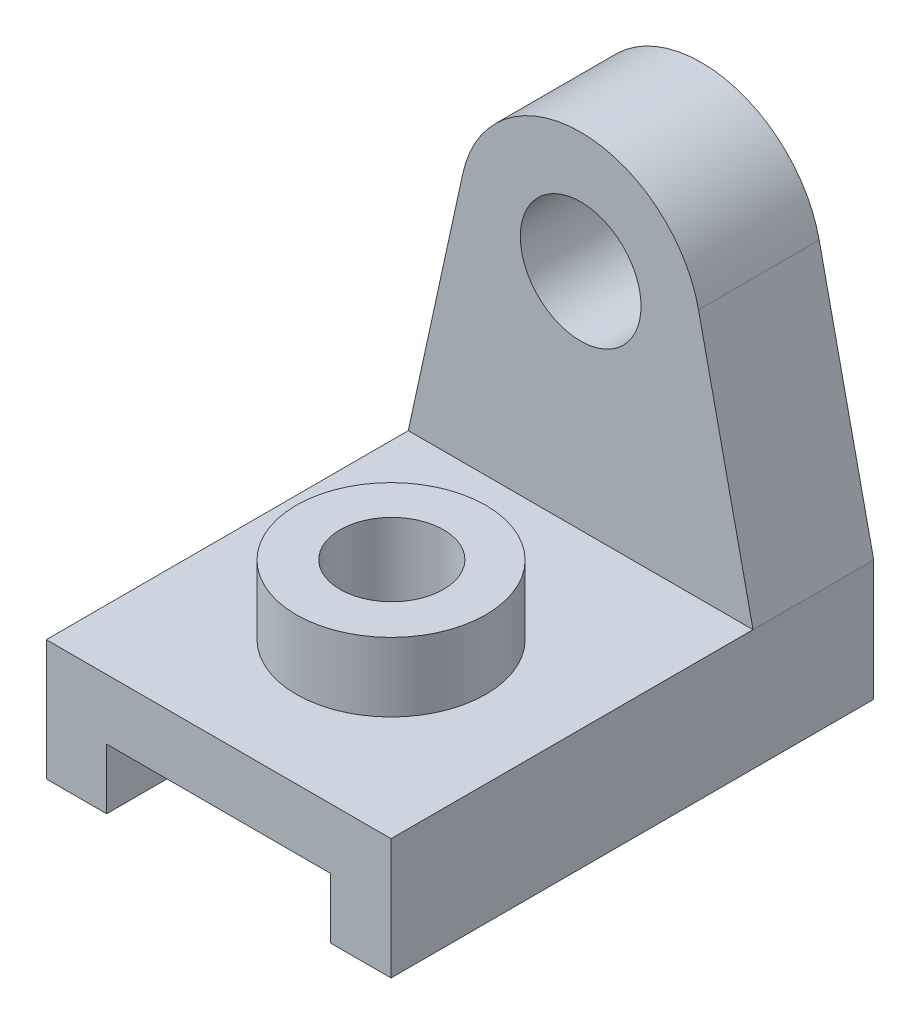
ISO-10303-21;
HEADER;
FILE_DESCRIPTION(('STEP AP214'),'2;1');
FILE_NAME('part.step','',(''),(''),'','','');
FILE_SCHEMA(('AUTOMOTIVE_DESIGN { 1 0 10303 214 1 1 1 1 }'));
ENDSEC;
DATA;
#1=APPLICATION_CONTEXT('core data for automotive mechanical design processes');
#2=APPLICATION_PROTOCOL_DEFINITION('international standard','automotive_design',2000,#1);
#3=PRODUCT_CONTEXT('',#1,'mechanical');
#4=PRODUCT('Part','Part','',(#3));
#5=PRODUCT_RELATED_PRODUCT_CATEGORY('part','',(#4));
#6=PRODUCT_DEFINITION_FORMATION('','',#4);
#7=PRODUCT_DEFINITION_CONTEXT('part definition',#1,'design');
#8=PRODUCT_DEFINITION('design','',#6,#7);
#9=PRODUCT_DEFINITION_SHAPE('','',#8);
#10=(LENGTH_UNIT() NAMED_UNIT(*) SI_UNIT(.MILLI.,.METRE.));
#11=(NAMED_UNIT(*) PLANE_ANGLE_UNIT() SI_UNIT($,.RADIAN.));
#12=(NAMED_UNIT(*) SI_UNIT($,.STERADIAN.) SOLID_ANGLE_UNIT());
#13=UNCERTAINTY_MEASURE_WITH_UNIT(LENGTH_MEASURE(1.E-05),#10,'distance_accuracy_value','');
#14=(GEOMETRIC_REPRESENTATION_CONTEXT(3) GLOBAL_UNCERTAINTY_ASSIGNED_CONTEXT((#13)) GLOBAL_UNIT_ASSIGNED_CONTEXT((#10,
#11,#12)) REPRESENTATION_CONTEXT('',''));
#15=CARTESIAN_POINT('',(0.,0.,0.));
#16=DIRECTION('',(0.,0.,1.));
#17=DIRECTION('',(1.,0.,0.));
#18=AXIS2_PLACEMENT_3D('',#15,#16,#17);
#19=CARTESIAN_POINT('',(-20.,7.,56.));
#20=DIRECTION('',(0.,1.,0.));
#21=DIRECTION('',(0.,0.,1.));
#22=AXIS2_PLACEMENT_3D('',#19,#20,#21);
#23=PLANE('',#22);
#24=CARTESIAN_POINT('',(0.,7.,36.));
#25=DIRECTION('',(0.,1.,0.));
#26=DIRECTION('',(0.,0.,1.));
#27=AXIS2_PLACEMENT_3D('',#24,#25,#26);
#28=CIRCLE('',#27,11.);
#29=CARTESIAN_POINT('',(0.,7.,47.));
#30=VERTEX_POINT('',#29);
#31=EDGE_CURVE('E347',#30,#30,#28,.T.);
#32=ORIENTED_EDGE('',*,*,#31,.F.);
#33=EDGE_LOOP('',(#32));
#34=FACE_BOUND('',#33,.T.);
#35=DIRECTION('',(1.,0.,0.));
#36=VECTOR('',#35,1.);
#37=CARTESIAN_POINT('',(0.,7.,14.));
#38=LINE('',#37,#36);
#39=CARTESIAN_POINT('',(-20.,7.,14.));
#40=VERTEX_POINT('',#39);
#41=CARTESIAN_POINT('',(20.,7.,14.));
#42=VERTEX_POINT('',#41);
#43=EDGE_CURVE('E60',#40,#42,#38,.T.);
#44=ORIENTED_EDGE('',*,*,#43,.F.);
#45=DIRECTION('',(0.,0.,-1.));
#46=VECTOR('',#45,1.);
#47=CARTESIAN_POINT('',(-20.,7.,56.));
#48=LINE('',#47,#46);
#49=CARTESIAN_POINT('',(-20.,7.,56.));
#50=VERTEX_POINT('',#49);
#51=EDGE_CURVE('E11',#50,#40,#48,.T.);
#52=ORIENTED_EDGE('',*,*,#51,.F.);
#53=DIRECTION('',(1.,0.,0.));
#54=VECTOR('',#53,1.);
#55=CARTESIAN_POINT('',(-20.,7.,56.));
#56=LINE('',#55,#54);
#57=CARTESIAN_POINT('',(20.,7.,56.));
#58=VERTEX_POINT('',#57);
#59=EDGE_CURVE('E179',#50,#58,#56,.T.);
#60=ORIENTED_EDGE('',*,*,#59,.T.);
#61=DIRECTION('',(0.,0.,-1.));
#62=VECTOR('',#61,1.);
#63=CARTESIAN_POINT('',(20.,7.,56.));
#64=LINE('',#63,#62);
#65=EDGE_CURVE('E46',#58,#42,#64,.T.);
#66=ORIENTED_EDGE('',*,*,#65,.T.);
#67=EDGE_LOOP('',(#44,#52,#60,#66));
#68=FACE_BOUND('',#67,.T.);
#69=ADVANCED_FACE('F43',(#34,#68),#23,.T.);
#70=CARTESIAN_POINT('',(-20.,7.,56.));
#71=DIRECTION('',(1.,0.,0.));
#72=DIRECTION('',(0.,0.,-1.));
#73=AXIS2_PLACEMENT_3D('',#70,#71,#72);
#74=PLANE('',#73);
#75=DIRECTION('',(0.,-1.,0.));
#76=VECTOR('',#75,1.);
#77=CARTESIAN_POINT('',(-20.,7.,0.));
#78=LINE('',#77,#76);
#79=CARTESIAN_POINT('',(-20.,7.,0.));
#80=VERTEX_POINT('',#79);
#81=CARTESIAN_POINT('',(-20.,-7.,0.));
#82=VERTEX_POINT('',#81);
#83=EDGE_CURVE('E177',#80,#82,#78,.T.);
#84=ORIENTED_EDGE('',*,*,#83,.T.);
#85=DIRECTION('',(0.,0.,-1.));
#86=VECTOR('',#85,1.);
#87=CARTESIAN_POINT('',(-20.,-7.,56.));
#88=LINE('',#87,#86);
#89=CARTESIAN_POINT('',(-20.,-7.,56.));
#90=VERTEX_POINT('',#89);
#91=EDGE_CURVE('E52',#90,#82,#88,.T.);
#92=ORIENTED_EDGE('',*,*,#91,.F.);
#93=DIRECTION('',(0.,-1.,0.));
#94=VECTOR('',#93,1.);
#95=CARTESIAN_POINT('',(-20.,7.,56.));
#96=LINE('',#95,#94);
#97=EDGE_CURVE('E129',#50,#90,#96,.T.);
#98=ORIENTED_EDGE('',*,*,#97,.F.);
#99=ORIENTED_EDGE('',*,*,#51,.T.);
#100=DIRECTION('',(0.,0.,-1.));
#101=VECTOR('',#100,1.);
#102=CARTESIAN_POINT('',(-20.,7.,14.));
#103=LINE('',#102,#101);
#104=EDGE_CURVE('E96',#40,#80,#103,.T.);
#105=ORIENTED_EDGE('',*,*,#104,.T.);
#106=EDGE_LOOP('',(#84,#92,#98,#99,#105));
#107=FACE_BOUND('',#106,.T.);
#108=ADVANCED_FACE('F284',(#107),#74,.F.);
#109=CARTESIAN_POINT('',(-20.,-7.,56.));
#110=DIRECTION('',(0.,1.,0.));
#111=DIRECTION('',(0.,0.,1.));
#112=AXIS2_PLACEMENT_3D('',#109,#110,#111);
#113=PLANE('',#112);
#114=DIRECTION('',(1.,0.,0.));
#115=VECTOR('',#114,1.);
#116=CARTESIAN_POINT('',(-20.,-7.,0.));
#117=LINE('',#116,#115);
#118=CARTESIAN_POINT('',(-13.,-7.,0.));
#119=VERTEX_POINT('',#118);
#120=EDGE_CURVE('E139',#82,#119,#117,.T.);
#121=ORIENTED_EDGE('',*,*,#120,.T.);
#122=DIRECTION('',(0.,0.,-1.));
#123=VECTOR('',#122,1.);
#124=CARTESIAN_POINT('',(-13.,-7.,56.));
#125=LINE('',#124,#123);
#126=CARTESIAN_POINT('',(-13.,-7.,56.));
#127=VERTEX_POINT('',#126);
#128=EDGE_CURVE('E136',#127,#119,#125,.T.);
#129=ORIENTED_EDGE('',*,*,#128,.F.);
#130=DIRECTION('',(1.,0.,0.));
#131=VECTOR('',#130,1.);
#132=CARTESIAN_POINT('',(-20.,-7.,56.));
#133=LINE('',#132,#131);
#134=EDGE_CURVE('E122',#90,#127,#133,.T.);
#135=ORIENTED_EDGE('',*,*,#134,.F.);
#136=ORIENTED_EDGE('',*,*,#91,.T.);
#137=EDGE_LOOP('',(#121,#129,#135,#136));
#138=FACE_BOUND('',#137,.T.);
#139=ADVANCED_FACE('F137',(#138),#113,.F.);
#140=CARTESIAN_POINT('',(-13.,-7.,56.));
#141=DIRECTION('',(-1.,0.,0.));
#142=DIRECTION('',(0.,0.,1.));
#143=AXIS2_PLACEMENT_3D('',#140,#141,#142);
#144=PLANE('',#143);
#145=DIRECTION('',(0.,1.,0.));
#146=VECTOR('',#145,1.);
#147=CARTESIAN_POINT('',(-13.,-7.,0.));
#148=LINE('',#147,#146);
#149=CARTESIAN_POINT('',(-13.,0.,0.));
#150=VERTEX_POINT('',#149);
#151=EDGE_CURVE('E172',#119,#150,#148,.T.);
#152=ORIENTED_EDGE('',*,*,#151,.T.);
#153=DIRECTION('',(0.,0.,-1.));
#154=VECTOR('',#153,1.);
#155=CARTESIAN_POINT('',(-13.,0.,56.));
#156=LINE('',#155,#154);
#157=CARTESIAN_POINT('',(-13.,0.,56.));
#158=VERTEX_POINT('',#157);
#159=EDGE_CURVE('E143',#158,#150,#156,.T.);
#160=ORIENTED_EDGE('',*,*,#159,.F.);
#161=DIRECTION('',(0.,1.,0.));
#162=VECTOR('',#161,1.);
#163=CARTESIAN_POINT('',(-13.,-7.,56.));
#164=LINE('',#163,#162);
#165=EDGE_CURVE('E127',#127,#158,#164,.T.);
#166=ORIENTED_EDGE('',*,*,#165,.F.);
#167=ORIENTED_EDGE('',*,*,#128,.T.);
#168=EDGE_LOOP('',(#152,#160,#166,#167));
#169=FACE_BOUND('',#168,.T.);
#170=ADVANCED_FACE('F145',(#169),#144,.F.);
#171=CARTESIAN_POINT('',(-13.,0.,56.));
#172=DIRECTION('',(0.,1.,0.));
#173=DIRECTION('',(0.,0.,1.));
#174=AXIS2_PLACEMENT_3D('',#171,#172,#173);
#175=PLANE('',#174);
#176=CARTESIAN_POINT('',(0.,0.,35.9117406734025));
#177=DIRECTION('',(0.,1.,0.));
#178=DIRECTION('',(0.,0.,1.));
#179=AXIS2_PLACEMENT_3D('',#176,#177,#178);
#180=CIRCLE('',#179,6.);
#181=CARTESIAN_POINT('',(0.,0.,41.9117406734025));
#182=VERTEX_POINT('',#181);
#183=EDGE_CURVE('E345',#182,#182,#180,.T.);
#184=ORIENTED_EDGE('',*,*,#183,.T.);
#185=EDGE_LOOP('',(#184));
#186=FACE_BOUND('',#185,.T.);
#187=DIRECTION('',(1.,0.,0.));
#188=VECTOR('',#187,1.);
#189=CARTESIAN_POINT('',(-13.,0.,0.));
#190=LINE('',#189,#188);
#191=CARTESIAN_POINT('',(13.,0.,0.));
#192=VERTEX_POINT('',#191);
#193=EDGE_CURVE('E169',#150,#192,#190,.T.);
#194=ORIENTED_EDGE('',*,*,#193,.T.);
#195=DIRECTION('',(0.,0.,-1.));
#196=VECTOR('',#195,1.);
#197=CARTESIAN_POINT('',(13.,0.,56.));
#198=LINE('',#197,#196);
#199=CARTESIAN_POINT('',(13.,0.,56.));
#200=VERTEX_POINT('',#199);
#201=EDGE_CURVE('E185',#200,#192,#198,.T.);
#202=ORIENTED_EDGE('',*,*,#201,.F.);
#203=DIRECTION('',(1.,0.,0.));
#204=VECTOR('',#203,1.);
#205=CARTESIAN_POINT('',(-13.,0.,56.));
#206=LINE('',#205,#204);
#207=EDGE_CURVE('E149',#158,#200,#206,.T.);
#208=ORIENTED_EDGE('',*,*,#207,.F.);
#209=ORIENTED_EDGE('',*,*,#159,.T.);
#210=EDGE_LOOP('',(#194,#202,#208,#209));
#211=FACE_BOUND('',#210,.T.);
#212=ADVANCED_FACE('F298',(#186,#211),#175,.F.);
#213=CARTESIAN_POINT('',(13.,0.,56.));
#214=DIRECTION('',(1.,0.,0.));
#215=DIRECTION('',(0.,0.,-1.));
#216=AXIS2_PLACEMENT_3D('',#213,#214,#215);
#217=PLANE('',#216);
#218=DIRECTION('',(0.,-1.,0.));
#219=VECTOR('',#218,1.);
#220=CARTESIAN_POINT('',(13.,0.,0.));
#221=LINE('',#220,#219);
#222=CARTESIAN_POINT('',(13.,-7.,0.));
#223=VERTEX_POINT('',#222);
#224=EDGE_CURVE('E166',#192,#223,#221,.T.);
#225=ORIENTED_EDGE('',*,*,#224,.T.);
#226=DIRECTION('',(0.,0.,-1.));
#227=VECTOR('',#226,1.);
#228=CARTESIAN_POINT('',(13.,-7.,56.));
#229=LINE('',#228,#227);
#230=CARTESIAN_POINT('',(13.,-7.,56.));
#231=VERTEX_POINT('',#230);
#232=EDGE_CURVE('E189',#231,#223,#229,.T.);
#233=ORIENTED_EDGE('',*,*,#232,.F.);
#234=DIRECTION('',(0.,-1.,0.));
#235=VECTOR('',#234,1.);
#236=CARTESIAN_POINT('',(13.,0.,56.));
#237=LINE('',#236,#235);
#238=EDGE_CURVE('E152',#200,#231,#237,.T.);
#239=ORIENTED_EDGE('',*,*,#238,.F.);
#240=ORIENTED_EDGE('',*,*,#201,.T.);
#241=EDGE_LOOP('',(#225,#233,#239,#240));
#242=FACE_BOUND('',#241,.T.);
#243=ADVANCED_FACE('F265',(#242),#217,.F.);
#244=CARTESIAN_POINT('',(13.,-7.,56.));
#245=DIRECTION('',(0.,1.,0.));
#246=DIRECTION('',(0.,0.,1.));
#247=AXIS2_PLACEMENT_3D('',#244,#245,#246);
#248=PLANE('',#247);
#249=DIRECTION('',(1.,0.,0.));
#250=VECTOR('',#249,1.);
#251=CARTESIAN_POINT('',(13.,-7.,0.));
#252=LINE('',#251,#250);
#253=CARTESIAN_POINT('',(20.,-7.,0.));
#254=VERTEX_POINT('',#253);
#255=EDGE_CURVE('E162',#223,#254,#252,.T.);
#256=ORIENTED_EDGE('',*,*,#255,.T.);
#257=DIRECTION('',(0.,0.,-1.));
#258=VECTOR('',#257,1.);
#259=CARTESIAN_POINT('',(20.,-7.,56.));
#260=LINE('',#259,#258);
#261=CARTESIAN_POINT('',(20.,-7.,56.));
#262=VERTEX_POINT('',#261);
#263=EDGE_CURVE('E192',#262,#254,#260,.T.);
#264=ORIENTED_EDGE('',*,*,#263,.F.);
#265=DIRECTION('',(1.,0.,0.));
#266=VECTOR('',#265,1.);
#267=CARTESIAN_POINT('',(13.,-7.,56.));
#268=LINE('',#267,#266);
#269=EDGE_CURVE('E257',#231,#262,#268,.T.);
#270=ORIENTED_EDGE('',*,*,#269,.F.);
#271=ORIENTED_EDGE('',*,*,#232,.T.);
#272=EDGE_LOOP('',(#256,#264,#270,#271));
#273=FACE_BOUND('',#272,.T.);
#274=ADVANCED_FACE('F269',(#273),#248,.F.);
#275=CARTESIAN_POINT('',(20.,7.,56.));
#276=DIRECTION('',(1.,0.,0.));
#277=DIRECTION('',(0.,0.,-1.));
#278=AXIS2_PLACEMENT_3D('',#275,#276,#277);
#279=PLANE('',#278);
#280=DIRECTION('',(0.,-1.,0.));
#281=VECTOR('',#280,1.);
#282=CARTESIAN_POINT('',(20.,7.,0.));
#283=LINE('',#282,#281);
#284=CARTESIAN_POINT('',(20.,7.,0.));
#285=VERTEX_POINT('',#284);
#286=EDGE_CURVE('E158',#285,#254,#283,.T.);
#287=ORIENTED_EDGE('',*,*,#286,.F.);
#288=DIRECTION('',(0.,0.,-1.));
#289=VECTOR('',#288,1.);
#290=CARTESIAN_POINT('',(20.,7.,14.));
#291=LINE('',#290,#289);
#292=EDGE_CURVE('E199',#42,#285,#291,.T.);
#293=ORIENTED_EDGE('',*,*,#292,.F.);
#294=ORIENTED_EDGE('',*,*,#65,.F.);
#295=DIRECTION('',(0.,-1.,0.));
#296=VECTOR('',#295,1.);
#297=CARTESIAN_POINT('',(20.,7.,56.));
#298=LINE('',#297,#296);
#299=EDGE_CURVE('E254',#58,#262,#298,.T.);
#300=ORIENTED_EDGE('',*,*,#299,.T.);
#301=ORIENTED_EDGE('',*,*,#263,.T.);
#302=EDGE_LOOP('',(#287,#293,#294,#300,#301));
#303=FACE_BOUND('',#302,.T.);
#304=ADVANCED_FACE('F201',(#303),#279,.T.);
#305=CARTESIAN_POINT('',(0.,0.,56.));
#306=DIRECTION('',(0.,0.,-1.));
#307=DIRECTION('',(-1.,0.,0.));
#308=AXIS2_PLACEMENT_3D('',#305,#306,#307);
#309=PLANE('',#308);
#310=ORIENTED_EDGE('',*,*,#59,.F.);
#311=ORIENTED_EDGE('',*,*,#97,.T.);
#312=ORIENTED_EDGE('',*,*,#134,.T.);
#313=ORIENTED_EDGE('',*,*,#165,.T.);
#314=ORIENTED_EDGE('',*,*,#207,.T.);
#315=ORIENTED_EDGE('',*,*,#238,.T.);
#316=ORIENTED_EDGE('',*,*,#269,.T.);
#317=ORIENTED_EDGE('',*,*,#299,.F.);
#318=EDGE_LOOP('',(#310,#311,#312,#313,#314,#315,#316,#317));
#319=FACE_BOUND('',#318,.T.);
#320=ADVANCED_FACE('F125',(#319),#309,.F.);
#321=CARTESIAN_POINT('',(0.,0.,0.));
#322=DIRECTION('',(0.,0.,-1.));
#323=DIRECTION('',(-1.,0.,0.));
#324=AXIS2_PLACEMENT_3D('',#321,#322,#323);
#325=PLANE('',#324);
#326=ORIENTED_EDGE('',*,*,#83,.F.);
#327=DIRECTION('',(0.213100259263618,0.977030337042704,0.));
#328=VECTOR('',#327,1.);
#329=CARTESIAN_POINT('',(-20.5492035169611,4.48199040613194,0.));
#330=LINE('',#329,#328);
#331=CARTESIAN_POINT('',(-13.6784247185979,35.9834036296906,0.));
#332=VERTEX_POINT('',#331);
#333=EDGE_CURVE('E235',#80,#332,#330,.T.);
#334=ORIENTED_EDGE('',*,*,#333,.T.);
#335=CARTESIAN_POINT('',(0.,33.,0.));
#336=DIRECTION('',(0.,0.,-1.));
#337=DIRECTION('',(-1.,0.,0.));
#338=AXIS2_PLACEMENT_3D('',#335,#336,#337);
#339=CIRCLE('',#338,14.);
#340=CARTESIAN_POINT('',(13.6784247185978,35.9834036296907,0.));
#341=VERTEX_POINT('',#340);
#342=EDGE_CURVE('E240',#332,#341,#339,.T.);
#343=ORIENTED_EDGE('',*,*,#342,.T.);
#344=DIRECTION('',(-0.213100259263618,0.977030337042704,0.));
#345=VECTOR('',#344,1.);
#346=CARTESIAN_POINT('',(20.5492035169611,4.48199040613196,0.));
#347=LINE('',#346,#345);
#348=EDGE_CURVE('E244',#285,#341,#347,.T.);
#349=ORIENTED_EDGE('',*,*,#348,.F.);
#350=ORIENTED_EDGE('',*,*,#286,.T.);
#351=ORIENTED_EDGE('',*,*,#255,.F.);
#352=ORIENTED_EDGE('',*,*,#224,.F.);
#353=ORIENTED_EDGE('',*,*,#193,.F.);
#354=ORIENTED_EDGE('',*,*,#151,.F.);
#355=ORIENTED_EDGE('',*,*,#120,.F.);
#356=EDGE_LOOP('',(#326,#334,#343,#349,#350,#351,#352,#353,#354,#355));
#357=FACE_BOUND('',#356,.T.);
#358=CARTESIAN_POINT('',(0.,33.,0.));
#359=DIRECTION('',(0.,0.,-1.));
#360=DIRECTION('',(-1.,0.,0.));
#361=AXIS2_PLACEMENT_3D('',#358,#359,#360);
#362=CIRCLE('',#361,7.);
#363=CARTESIAN_POINT('',(-7.,33.,0.));
#364=VERTEX_POINT('',#363);
#365=EDGE_CURVE('E231',#364,#364,#362,.T.);
#366=ORIENTED_EDGE('',*,*,#365,.F.);
#367=EDGE_LOOP('',(#366));
#368=FACE_BOUND('',#367,.T.);
#369=ADVANCED_FACE('F271',(#357,#368),#325,.T.);
#370=CARTESIAN_POINT('',(-20.5492035169611,4.48199040613194,14.));
#371=DIRECTION('',(-0.977030337042703,0.213100259263618,0.));
#372=DIRECTION('',(-0.213100259263618,-0.977030337042704,0.));
#373=AXIS2_PLACEMENT_3D('',#370,#371,#372);
#374=PLANE('',#373);
#375=ORIENTED_EDGE('',*,*,#333,.F.);
#376=ORIENTED_EDGE('',*,*,#104,.F.);
#377=DIRECTION('',(0.213100259263618,0.977030337042704,0.));
#378=VECTOR('',#377,1.);
#379=CARTESIAN_POINT('',(-20.5492035169611,4.48199040613194,14.));
#380=LINE('',#379,#378);
#381=CARTESIAN_POINT('',(-13.6784247185979,35.9834036296906,14.));
#382=VERTEX_POINT('',#381);
#383=EDGE_CURVE('E222',#40,#382,#380,.T.);
#384=ORIENTED_EDGE('',*,*,#383,.T.);
#385=DIRECTION('',(0.,0.,-1.));
#386=VECTOR('',#385,1.);
#387=CARTESIAN_POINT('',(-13.6784247185979,35.9834036296906,14.));
#388=LINE('',#387,#386);
#389=EDGE_CURVE('E224',#382,#332,#388,.T.);
#390=ORIENTED_EDGE('',*,*,#389,.T.);
#391=EDGE_LOOP('',(#375,#376,#384,#390));
#392=FACE_BOUND('',#391,.T.);
#393=ADVANCED_FACE('F282',(#392),#374,.T.);
#394=CARTESIAN_POINT('',(20.5492035169611,4.48199040613196,14.));
#395=DIRECTION('',(-0.977030337042703,-0.213100259263618,0.));
#396=DIRECTION('',(0.213100259263618,-0.977030337042703,0.));
#397=AXIS2_PLACEMENT_3D('',#394,#395,#396);
#398=PLANE('',#397);
#399=ORIENTED_EDGE('',*,*,#348,.T.);
#400=DIRECTION('',(0.,0.,-1.));
#401=VECTOR('',#400,1.);
#402=CARTESIAN_POINT('',(13.6784247185978,35.9834036296907,14.));
#403=LINE('',#402,#401);
#404=CARTESIAN_POINT('',(13.6784247185978,35.9834036296907,14.));
#405=VERTEX_POINT('',#404);
#406=EDGE_CURVE('E206',#405,#341,#403,.T.);
#407=ORIENTED_EDGE('',*,*,#406,.F.);
#408=DIRECTION('',(-0.213100259263618,0.977030337042704,0.));
#409=VECTOR('',#408,1.);
#410=CARTESIAN_POINT('',(20.5492035169611,4.48199040613196,14.));
#411=LINE('',#410,#409);
#412=EDGE_CURVE('E210',#42,#405,#411,.T.);
#413=ORIENTED_EDGE('',*,*,#412,.F.);
#414=ORIENTED_EDGE('',*,*,#292,.T.);
#415=EDGE_LOOP('',(#399,#407,#413,#414));
#416=FACE_BOUND('',#415,.T.);
#417=ADVANCED_FACE('F211',(#416),#398,.F.);
#418=CARTESIAN_POINT('',(0.,33.,14.));
#419=DIRECTION('',(0.,0.,-1.));
#420=DIRECTION('',(-1.,0.,0.));
#421=AXIS2_PLACEMENT_3D('',#418,#419,#420);
#422=CYLINDRICAL_SURFACE('',#421,7.);
#423=CARTESIAN_POINT('',(0.,33.,14.));
#424=DIRECTION('',(0.,0.,-1.));
#425=DIRECTION('',(-1.,0.,0.));
#426=AXIS2_PLACEMENT_3D('',#423,#424,#425);
#427=CIRCLE('',#426,7.);
#428=CARTESIAN_POINT('',(-7.,33.,14.));
#429=VERTEX_POINT('',#428);
#430=EDGE_CURVE('E247',#429,#429,#427,.T.);
#431=ORIENTED_EDGE('',*,*,#430,.F.);
#432=EDGE_LOOP('',(#431));
#433=FACE_BOUND('',#432,.T.);
#434=ORIENTED_EDGE('',*,*,#365,.T.);
#435=EDGE_LOOP('',(#434));
#436=FACE_BOUND('',#435,.T.);
#437=ADVANCED_FACE('F313',(#433,#436),#422,.F.);
#438=CARTESIAN_POINT('',(0.,33.,14.));
#439=DIRECTION('',(0.,0.,-1.));
#440=DIRECTION('',(-1.,0.,0.));
#441=AXIS2_PLACEMENT_3D('',#438,#439,#440);
#442=CYLINDRICAL_SURFACE('',#441,14.);
#443=ORIENTED_EDGE('',*,*,#342,.F.);
#444=ORIENTED_EDGE('',*,*,#389,.F.);
#445=CARTESIAN_POINT('',(0.,33.,14.));
#446=DIRECTION('',(0.,0.,-1.));
#447=DIRECTION('',(-1.,0.,0.));
#448=AXIS2_PLACEMENT_3D('',#445,#446,#447);
#449=CIRCLE('',#448,14.);
#450=EDGE_CURVE('E217',#382,#405,#449,.T.);
#451=ORIENTED_EDGE('',*,*,#450,.T.);
#452=ORIENTED_EDGE('',*,*,#406,.T.);
#453=EDGE_LOOP('',(#443,#444,#451,#452));
#454=FACE_BOUND('',#453,.T.);
#455=ADVANCED_FACE('F283',(#454),#442,.T.);
#456=CARTESIAN_POINT('',(0.,0.,14.));
#457=DIRECTION('',(0.,0.,-1.));
#458=DIRECTION('',(-1.,0.,0.));
#459=AXIS2_PLACEMENT_3D('',#456,#457,#458);
#460=PLANE('',#459);
#461=ORIENTED_EDGE('',*,*,#430,.T.);
#462=EDGE_LOOP('',(#461));
#463=FACE_BOUND('',#462,.T.);
#464=ORIENTED_EDGE('',*,*,#383,.F.);
#465=ORIENTED_EDGE('',*,*,#43,.T.);
#466=ORIENTED_EDGE('',*,*,#412,.T.);
#467=ORIENTED_EDGE('',*,*,#450,.F.);
#468=EDGE_LOOP('',(#464,#465,#466,#467));
#469=FACE_BOUND('',#468,.T.);
#470=ADVANCED_FACE('F220',(#463,#469),#460,.F.);
#471=CARTESIAN_POINT('',(0.,15.,36.));
#472=DIRECTION('',(0.,-1.,0.));
#473=DIRECTION('',(0.,0.,-1.));
#474=AXIS2_PLACEMENT_3D('',#471,#472,#473);
#475=CYLINDRICAL_SURFACE('',#474,11.);
#476=CARTESIAN_POINT('',(0.,15.,36.));
#477=DIRECTION('',(0.,1.,0.));
#478=DIRECTION('',(0.,0.,1.));
#479=AXIS2_PLACEMENT_3D('',#476,#477,#478);
#480=CIRCLE('',#479,11.);
#481=CARTESIAN_POINT('',(0.,15.,47.));
#482=VERTEX_POINT('',#481);
#483=EDGE_CURVE('E236',#482,#482,#480,.T.);
#484=ORIENTED_EDGE('',*,*,#483,.F.);
#485=EDGE_LOOP('',(#484));
#486=FACE_BOUND('',#485,.T.);
#487=ORIENTED_EDGE('',*,*,#31,.T.);
#488=EDGE_LOOP('',(#487));
#489=FACE_BOUND('',#488,.T.);
#490=ADVANCED_FACE('F325',(#486,#489),#475,.T.);
#491=CARTESIAN_POINT('',(0.,15.,36.));
#492=DIRECTION('',(0.,1.,0.));
#493=DIRECTION('',(0.,0.,1.));
#494=AXIS2_PLACEMENT_3D('',#491,#492,#493);
#495=PLANE('',#494);
#496=CARTESIAN_POINT('',(0.,15.,35.9117406734025));
#497=DIRECTION('',(0.,1.,0.));
#498=DIRECTION('',(0.,0.,1.));
#499=AXIS2_PLACEMENT_3D('',#496,#497,#498);
#500=CIRCLE('',#499,6.);
#501=CARTESIAN_POINT('',(0.,15.,41.9117406734025));
#502=VERTEX_POINT('',#501);
#503=EDGE_CURVE('E342',#502,#502,#500,.T.);
#504=ORIENTED_EDGE('',*,*,#503,.F.);
#505=EDGE_LOOP('',(#504));
#506=FACE_BOUND('',#505,.T.);
#507=ORIENTED_EDGE('',*,*,#483,.T.);
#508=EDGE_LOOP('',(#507));
#509=FACE_BOUND('',#508,.T.);
#510=ADVANCED_FACE('F329',(#506,#509),#495,.T.);
#511=CARTESIAN_POINT('',(0.,-13.,35.9117406734025));
#512=DIRECTION('',(0.,1.,0.));
#513=DIRECTION('',(0.,0.,1.));
#514=AXIS2_PLACEMENT_3D('',#511,#512,#513);
#515=CYLINDRICAL_SURFACE('',#514,6.);
#516=ORIENTED_EDGE('',*,*,#503,.T.);
#517=EDGE_LOOP('',(#516));
#518=FACE_BOUND('',#517,.T.);
#519=ORIENTED_EDGE('',*,*,#183,.F.);
#520=EDGE_LOOP('',(#519));
#521=FACE_BOUND('',#520,.T.);
#522=ADVANCED_FACE('F333',(#518,#521),#515,.F.);
#523=CLOSED_SHELL('',(#69,#108,#139,#170,#212,#243,#274,#304,#320,#369,#393,#417,#437,#455,#470,
#490,#510,#522));
#524=MANIFOLD_SOLID_BREP('B2',#523);
#525=ADVANCED_BREP_SHAPE_REPRESENTATION('',(#18,#524),#14);
#526=SHAPE_DEFINITION_REPRESENTATION(#9,#525);
ENDSEC;
END-ISO-10303-21;
